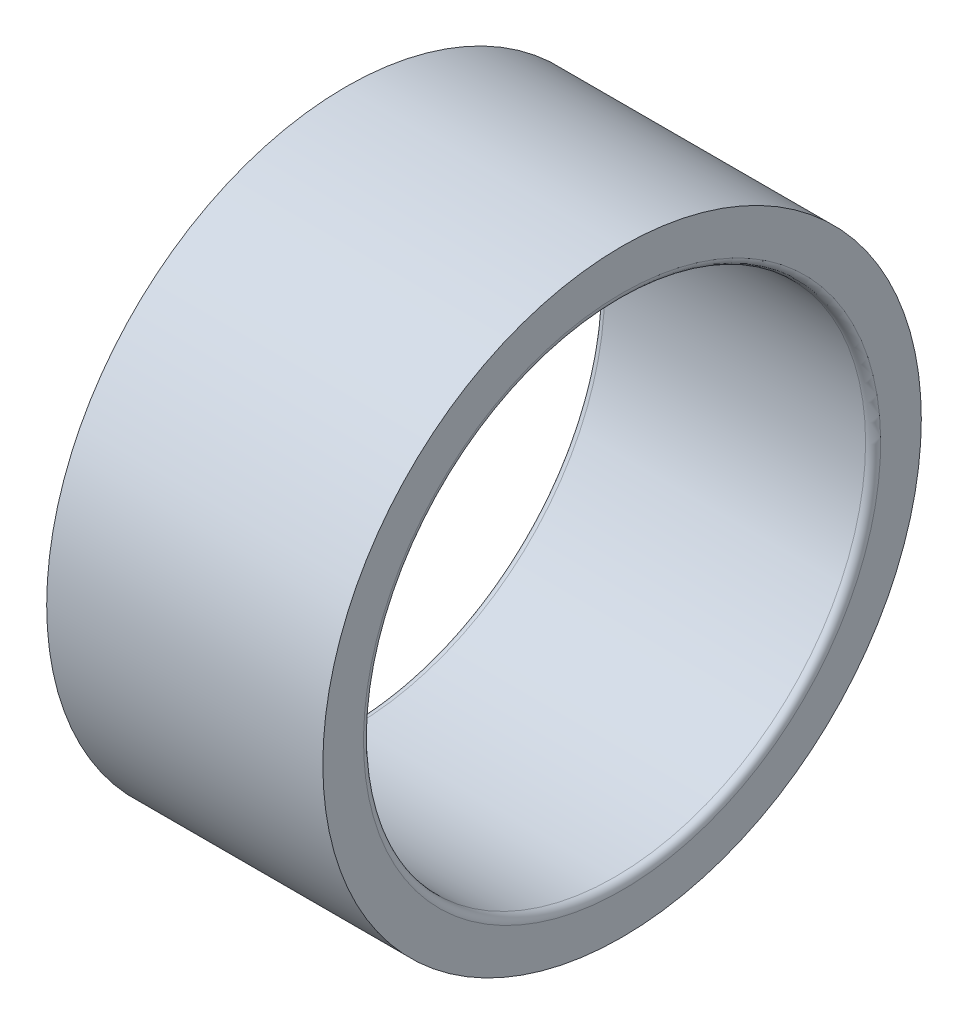
ISO-10303-21;
HEADER;
FILE_DESCRIPTION(('STEP AP214'),'2;1');
FILE_NAME('part.step','',(''),(''),'','','');
FILE_SCHEMA(('AUTOMOTIVE_DESIGN { 1 0 10303 214 1 1 1 1 }'));
ENDSEC;
DATA;
#1=APPLICATION_CONTEXT('core data for automotive mechanical design processes');
#2=APPLICATION_PROTOCOL_DEFINITION('international standard','automotive_design',2000,#1);
#3=PRODUCT_CONTEXT('',#1,'mechanical');
#4=PRODUCT('Part','Part','',(#3));
#5=PRODUCT_RELATED_PRODUCT_CATEGORY('part','',(#4));
#6=PRODUCT_DEFINITION_FORMATION('','',#4);
#7=PRODUCT_DEFINITION_CONTEXT('part definition',#1,'design');
#8=PRODUCT_DEFINITION('design','',#6,#7);
#9=PRODUCT_DEFINITION_SHAPE('','',#8);
#10=(LENGTH_UNIT() NAMED_UNIT(*) SI_UNIT(.MILLI.,.METRE.));
#11=(NAMED_UNIT(*) PLANE_ANGLE_UNIT() SI_UNIT($,.RADIAN.));
#12=(NAMED_UNIT(*) SI_UNIT($,.STERADIAN.) SOLID_ANGLE_UNIT());
#13=UNCERTAINTY_MEASURE_WITH_UNIT(LENGTH_MEASURE(1.E-05),#10,'distance_accuracy_value','');
#14=(GEOMETRIC_REPRESENTATION_CONTEXT(3) GLOBAL_UNCERTAINTY_ASSIGNED_CONTEXT((#13)) GLOBAL_UNIT_ASSIGNED_CONTEXT((#10,
#11,#12)) REPRESENTATION_CONTEXT('',''));
#15=CARTESIAN_POINT('',(0.,0.,0.));
#16=DIRECTION('',(0.,0.,1.));
#17=DIRECTION('',(1.,0.,0.));
#18=AXIS2_PLACEMENT_3D('',#15,#16,#17);
#19=CARTESIAN_POINT('',(26.,22.22,0.));
#20=DIRECTION('',(1.,0.,0.));
#21=DIRECTION('',(0.,1.,0.));
#22=AXIS2_PLACEMENT_3D('',#19,#20,#21);
#23=PLANE('',#22);
#24=CARTESIAN_POINT('',(26.,0.,0.));
#25=DIRECTION('',(1.,0.,0.));
#26=DIRECTION('',(0.,1.,0.));
#27=AXIS2_PLACEMENT_3D('',#24,#25,#26);
#28=CIRCLE('',#27,23.84);
#29=CARTESIAN_POINT('',(26.,23.84,0.));
#30=VERTEX_POINT('',#29);
#31=EDGE_CURVE('E11',#30,#30,#28,.T.);
#32=ORIENTED_EDGE('',*,*,#31,.T.);
#33=EDGE_LOOP('',(#32));
#34=FACE_BOUND('',#33,.T.);
#35=CARTESIAN_POINT('',(26.,0.,0.));
#36=DIRECTION('',(1.,0.,0.));
#37=DIRECTION('',(0.,1.,0.));
#38=AXIS2_PLACEMENT_3D('',#35,#36,#37);
#39=CIRCLE('',#38,20.6);
#40=CARTESIAN_POINT('',(26.,20.6,0.));
#41=VERTEX_POINT('',#40);
#42=EDGE_CURVE('E96',#41,#41,#39,.T.);
#43=ORIENTED_EDGE('',*,*,#42,.F.);
#44=EDGE_LOOP('',(#43));
#45=FACE_BOUND('',#44,.T.);
#46=ADVANCED_FACE('F17',(#34,#45),#23,.T.);
#47=CARTESIAN_POINT('',(15.,0.,0.));
#48=DIRECTION('',(-1.,0.,0.));
#49=DIRECTION('',(0.,1.,0.));
#50=AXIS2_PLACEMENT_3D('',#47,#48,#49);
#51=CYLINDRICAL_SURFACE('',#50,23.84);
#52=CARTESIAN_POINT('',(4.,0.,0.));
#53=DIRECTION('',(1.,0.,0.));
#54=DIRECTION('',(0.,1.,0.));
#55=AXIS2_PLACEMENT_3D('',#52,#53,#54);
#56=CIRCLE('',#55,23.84);
#57=CARTESIAN_POINT('',(4.,23.84,0.));
#58=VERTEX_POINT('',#57);
#59=EDGE_CURVE('E29',#58,#58,#56,.T.);
#60=ORIENTED_EDGE('',*,*,#59,.T.);
#61=EDGE_LOOP('',(#60));
#62=FACE_BOUND('',#61,.T.);
#63=ORIENTED_EDGE('',*,*,#31,.F.);
#64=EDGE_LOOP('',(#63));
#65=FACE_BOUND('',#64,.T.);
#66=ADVANCED_FACE('F19',(#62,#65),#51,.T.);
#67=CARTESIAN_POINT('',(4.,22.22,0.));
#68=DIRECTION('',(-1.,0.,0.));
#69=DIRECTION('',(0.,-1.,0.));
#70=AXIS2_PLACEMENT_3D('',#67,#68,#69);
#71=PLANE('',#70);
#72=CARTESIAN_POINT('',(4.,0.,0.));
#73=DIRECTION('',(1.,0.,0.));
#74=DIRECTION('',(0.,1.,0.));
#75=AXIS2_PLACEMENT_3D('',#72,#73,#74);
#76=CIRCLE('',#75,20.6);
#77=CARTESIAN_POINT('',(4.,20.6,0.));
#78=VERTEX_POINT('',#77);
#79=EDGE_CURVE('E57',#78,#78,#76,.T.);
#80=ORIENTED_EDGE('',*,*,#79,.T.);
#81=EDGE_LOOP('',(#80));
#82=FACE_BOUND('',#81,.T.);
#83=ORIENTED_EDGE('',*,*,#59,.F.);
#84=EDGE_LOOP('',(#83));
#85=FACE_BOUND('',#84,.T.);
#86=ADVANCED_FACE('F76',(#82,#85),#71,.T.);
#87=CARTESIAN_POINT('',(4.6,0.,0.));
#88=DIRECTION('',(1.,0.,0.));
#89=DIRECTION('',(0.,0.,-1.));
#90=AXIS2_PLACEMENT_3D('',#87,#88,#89);
#91=TOROIDAL_SURFACE('',#90,20.6,0.6);
#92=CARTESIAN_POINT('',(4.6,0.,0.));
#93=DIRECTION('',(1.,0.,0.));
#94=DIRECTION('',(0.,1.,0.));
#95=AXIS2_PLACEMENT_3D('',#92,#93,#94);
#96=CIRCLE('',#95,20.);
#97=CARTESIAN_POINT('',(4.6,20.,0.));
#98=VERTEX_POINT('',#97);
#99=EDGE_CURVE('E100',#98,#98,#96,.T.);
#100=ORIENTED_EDGE('',*,*,#99,.T.);
#101=EDGE_LOOP('',(#100));
#102=FACE_BOUND('',#101,.T.);
#103=ORIENTED_EDGE('',*,*,#79,.F.);
#104=EDGE_LOOP('',(#103));
#105=FACE_BOUND('',#104,.T.);
#106=ADVANCED_FACE('F72',(#102,#105),#91,.T.);
#107=CARTESIAN_POINT('',(15.,0.,0.));
#108=DIRECTION('',(-1.,0.,0.));
#109=DIRECTION('',(0.,1.,0.));
#110=AXIS2_PLACEMENT_3D('',#107,#108,#109);
#111=CYLINDRICAL_SURFACE('',#110,20.);
#112=CARTESIAN_POINT('',(25.4,0.,0.));
#113=DIRECTION('',(1.,0.,0.));
#114=DIRECTION('',(0.,1.,0.));
#115=AXIS2_PLACEMENT_3D('',#112,#113,#114);
#116=CIRCLE('',#115,20.);
#117=CARTESIAN_POINT('',(25.4,20.,0.));
#118=VERTEX_POINT('',#117);
#119=EDGE_CURVE('E101',#118,#118,#116,.T.);
#120=ORIENTED_EDGE('',*,*,#119,.T.);
#121=EDGE_LOOP('',(#120));
#122=FACE_BOUND('',#121,.T.);
#123=ORIENTED_EDGE('',*,*,#99,.F.);
#124=EDGE_LOOP('',(#123));
#125=FACE_BOUND('',#124,.T.);
#126=CARTESIAN_POINT('',(15.,19.9436706751791,1.5));
#127=CARTESIAN_POINT('',(15.023980802461,19.9436710684542,1.49999331675062));
#128=CARTESIAN_POINT('',(15.0479604681232,19.9437164250224,1.49939168004259));
#129=CARTESIAN_POINT('',(15.0959637294917,19.9438950890934,1.4970141183959));
#130=CARTESIAN_POINT('',(15.1199870773639,19.9440287703363,1.49523320334707));
#131=CARTESIAN_POINT('',(15.1680774613603,19.9443832363342,1.49049745799294));
#132=CARTESIAN_POINT('',(15.1921437325988,19.9446045922579,1.48753492899746));
#133=CARTESIAN_POINT('',(15.2403205020601,19.9451325285161,1.48043953807659));
#134=CARTESIAN_POINT('',(15.26442948643,19.9454398500646,1.47629649140751));
#135=CARTESIAN_POINT('',(15.3131315536388,19.946143853933,1.46675458037655));
#136=CARTESIAN_POINT('',(15.3377180916965,19.9465428931121,1.4613224429462));
#137=CARTESIAN_POINT('',(15.3863769413026,19.9474198662536,1.44930212194746));
#138=CARTESIAN_POINT('',(15.4104518728253,19.9478970763389,1.44272451333143));
#139=CARTESIAN_POINT('',(15.4580874727516,19.9489267481172,1.42841615242702));
#140=CARTESIAN_POINT('',(15.4816504448731,19.949478709228,1.4206930409385));
#141=CARTESIAN_POINT('',(15.5282627098288,19.9506536579477,1.40409670044076));
#142=CARTESIAN_POINT('',(15.5513136476873,19.9512763601425,1.39522807460773));
#143=CARTESIAN_POINT('',(15.5969120138774,19.9525883921862,1.37633787770728));
#144=CARTESIAN_POINT('',(15.6194598749038,19.9532776618287,1.36631734693983));
#145=CARTESIAN_POINT('',(15.6641214412139,19.9547189650343,1.34510390995097));
#146=CARTESIAN_POINT('',(15.6862326880103,19.9554712713405,1.33390584936858));
#147=CARTESIAN_POINT('',(15.7300228142682,19.9570325708787,1.31034017768309));
#148=CARTESIAN_POINT('',(15.7516975223367,19.9578419278595,1.29796484493805));
#149=CARTESIAN_POINT('',(15.7946160778946,19.9595107068897,1.27204656477276));
#150=CARTESIAN_POINT('',(15.8158538841722,19.9603705311789,1.25849365086004));
#151=CARTESIAN_POINT('',(15.8570532208134,19.9620975165634,1.23079241696214));
#152=CARTESIAN_POINT('',(15.8770338927284,19.9629637528728,1.21667249358004));
#153=CARTESIAN_POINT('',(15.916114361581,19.9647127466993,1.18762560886494));
#154=CARTESIAN_POINT('',(15.9352205787076,19.9655952784407,1.17270728258423));
#155=CARTESIAN_POINT('',(15.9725526831814,19.9673713859091,1.14206557793876));
#156=CARTESIAN_POINT('',(15.9907837900851,19.9682648413339,1.1263485551099));
#157=CARTESIAN_POINT('',(16.0263673651875,19.9700570531928,1.09411181495279));
#158=CARTESIAN_POINT('',(16.0437235335571,19.9709557654911,1.07759618164708));
#159=CARTESIAN_POINT('',(16.0775851950106,19.9727540111879,1.04373577650502));
#160=CARTESIAN_POINT('',(16.0940912214562,19.9736535437022,1.02639153801705));
#161=CARTESIAN_POINT('',(16.1263153699827,19.9754495871582,0.990824129159826));
#162=CARTESIAN_POINT('',(16.1420290328995,19.9763460591459,0.972596918901357));
#163=CARTESIAN_POINT('',(16.1726708287599,19.9781288145781,0.935265126406107));
#164=CARTESIAN_POINT('',(16.1875922254421,19.9790149720863,0.916155012328557));
#165=CARTESIAN_POINT('',(16.2166522970037,19.9807695918459,0.87705931915174));
#166=CARTESIAN_POINT('',(16.2307819620536,19.9816377986363,0.857067039773861));
#167=CARTESIAN_POINT('',(16.2584846987131,19.9833629687558,0.815868705662425));
#168=CARTESIAN_POINT('',(16.2720305653312,19.9842189124512,0.79464430460597));
#169=CARTESIAN_POINT('',(16.2979398582807,19.985878468615,0.751743547153647));
#170=CARTESIAN_POINT('',(16.3103128286278,19.9866824827042,0.730072976882195));
#171=CARTESIAN_POINT('',(16.3338789592962,19.9882338667972,0.68628251232157));
#172=CARTESIAN_POINT('',(16.345079396795,19.9889815769602,0.664166548834345));
#173=CARTESIAN_POINT('',(16.3663030676505,19.9904160291942,0.619487243255145));
#174=CARTESIAN_POINT('',(16.376330999111,19.9911030116885,0.596926141939594));
#175=CARTESIAN_POINT('',(16.3952225063084,19.9924124519929,0.551329563755814));
#176=CARTESIAN_POINT('',(16.4040865129006,19.9930349336614,0.528294266096447));
#177=CARTESIAN_POINT('',(16.4206770431784,19.9942118578399,0.481702786246169));
#178=CARTESIAN_POINT('',(16.4283984318771,19.9947659914392,0.458144769031443));
#179=CARTESIAN_POINT('',(16.4427072772283,19.9958009036741,0.410509036600132));
#180=CARTESIAN_POINT('',(16.4492865789474,19.9962811521821,0.386428862861273));
#181=CARTESIAN_POINT('',(16.4613138903367,19.9971628805585,0.337749602714912));
#182=CARTESIAN_POINT('',(16.4667508364302,19.9975635881946,0.31314777462503));
#183=CARTESIAN_POINT('',(16.4763045119005,19.998266561026,0.264408416299162));
#184=CARTESIAN_POINT('',(16.4804541572247,19.9985712843513,0.240277365889277));
#185=CARTESIAN_POINT('',(16.4875577059204,19.9990920868663,0.192070753435031));
#186=CARTESIAN_POINT('',(16.4905225163182,19.9993089748864,0.167996814053359));
#187=CARTESIAN_POINT('',(16.4952583730207,19.9996549120953,0.119905944142487));
#188=CARTESIAN_POINT('',(16.4970378640763,19.9997845827264,0.0958898519845909));
#189=CARTESIAN_POINT('',(16.4994058572011,19.99995691634,0.0479156477815767));
#190=CARTESIAN_POINT('',(16.5000001175012,19.9999999999977,0.0239578230083356));
#191=CARTESIAN_POINT('',(16.4999998825283,20.0000000000023,-0.0239518156098222));
#192=CARTESIAN_POINT('',(16.499405685297,19.9999569379529,-0.0479036294556239));
#193=CARTESIAN_POINT('',(16.4970378376718,19.9997846763257,-0.0958698235527699));
#194=CARTESIAN_POINT('',(16.4952582312377,19.9996550417594,-0.11988390664371));
#195=CARTESIAN_POINT('',(16.4905222670967,19.9993091626476,-0.167974750064875));
#196=CARTESIAN_POINT('',(16.4875572743388,19.9990922824804,-0.192050652939226));
#197=CARTESIAN_POINT('',(16.4804540222514,19.9985714363363,-0.240265309905812));
#198=CARTESIAN_POINT('',(16.4763046819705,19.9982666475754,-0.264402415864912));
#199=CARTESIAN_POINT('',(16.4667542033392,19.9975637598077,-0.313135875820699));
#200=CARTESIAN_POINT('',(16.4613209866334,19.9971632660456,-0.337725917082664));
#201=CARTESIAN_POINT('',(16.4492986960465,19.9962819085336,-0.386389484167737));
#202=CARTESIAN_POINT('',(16.4427203047546,19.9958017893614,-0.410465656985472));
#203=CARTESIAN_POINT('',(16.4284112847855,19.9947669913326,-0.458101335590933));
#204=CARTESIAN_POINT('',(16.4206884168677,19.9942128169604,-0.481663181389407));
#205=CARTESIAN_POINT('',(16.4040935724591,19.9930355731538,-0.528270576860182));
#206=CARTESIAN_POINT('',(16.3952263344836,19.9924127892878,-0.551317819733703));
#207=CARTESIAN_POINT('',(16.3763365990064,19.9911033279332,-0.596915128782865));
#208=CARTESIAN_POINT('',(16.3663148289848,19.9904166907311,-0.619465497485864));
#209=CARTESIAN_POINT('',(16.3450993656328,19.9889827709195,-0.664130504468885));
#210=CARTESIAN_POINT('',(16.3339005940014,19.988235228928,-0.686242720836129));
#211=CARTESIAN_POINT('',(16.3103342867197,19.9866839433985,-0.730033096083931));
#212=CARTESIAN_POINT('',(16.2979591118482,19.9858798427802,-0.751707128202924));
#213=CARTESIAN_POINT('',(16.27204232145,19.9842197883292,-0.794622565570553));
#214=CARTESIAN_POINT('',(16.2584908271441,19.9833634178233,-0.815857982072819));
#215=CARTESIAN_POINT('',(16.2307893803817,19.9816381951107,-0.8570575712127));
#216=CARTESIAN_POINT('',(16.2166675853829,19.9807703984325,-0.877040729909963));
#217=CARTESIAN_POINT('',(16.1876179930195,19.9790163792966,-0.91612426818883));
#218=CARTESIAN_POINT('',(16.1726989100111,19.9781304031621,-0.935231127904905));
#219=CARTESIAN_POINT('',(16.1420569672864,19.9763477230401,-0.97256280229388));
#220=CARTESIAN_POINT('',(16.1263405429935,19.9754511393444,-0.990792902186295));
#221=CARTESIAN_POINT('',(16.0941065089928,19.9736545065416,-1.02637295637634));
#222=CARTESIAN_POINT('',(16.0775930626209,19.9727544941635,-1.04372668235683));
#223=CARTESIAN_POINT('',(16.043732629496,19.9709561833997,-1.07758831242582));
#224=CARTESIAN_POINT('',(16.0263859504182,19.9700578845068,-1.09409652414215));
#225=CARTESIAN_POINT('',(15.9908150205399,19.9682662598783,-1.12632337867839));
#226=CARTESIAN_POINT('',(15.9725868013937,19.967372981747,-1.14203764174179));
#227=CARTESIAN_POINT('',(15.9352545750735,19.9655969296437,-1.17267920249121));
#228=CARTESIAN_POINT('',(15.9161451017194,19.9647142816745,-1.18759984380156));
#229=CARTESIAN_POINT('',(15.8770524781964,19.9629646897993,-1.2166572081823));
#230=CARTESIAN_POINT('',(15.8570626877123,19.9620979789101,-1.23078500062745));
#231=CARTESIAN_POINT('',(15.8158646101096,19.9603709133943,-1.25848752023458));
#232=CARTESIAN_POINT('',(15.7946378210064,19.9595114523869,-1.27203480331547));
#233=CARTESIAN_POINT('',(15.7517339476416,19.9578431792846,-1.29794558984251));
#234=CARTESIAN_POINT('',(15.7300627020256,19.9570339781615,-1.31031872496316));
#235=CARTESIAN_POINT('',(15.6862724761074,19.9554727191939,-1.33388420591455));
#236=CARTESIAN_POINT('',(15.6641574712951,19.9547203146362,-1.34508391151557));
#237=CARTESIAN_POINT('',(15.6194816302206,19.9532784679337,-1.36630561642376));
#238=CARTESIAN_POINT('',(15.5969230710606,19.9525887733201,-1.37633238938887));
#239=CARTESIAN_POINT('',(15.5513308957782,19.9512767934768,-1.39522183648666));
#240=CARTESIAN_POINT('',(15.5282974462201,19.950654485075,-1.40408491100379));
#241=CARTESIAN_POINT('',(15.4817085250093,19.9494800685112,-1.42067394724172));
#242=CARTESIAN_POINT('',(15.4581511981749,19.9489282822774,-1.42839471803276));
#243=CARTESIAN_POINT('',(15.4105155361025,19.9478986454463,-1.44270282504004));
#244=CARTESIAN_POINT('',(15.3864347218858,19.9474213336088,-1.44928193749416));
#245=CARTESIAN_POINT('',(15.3377528506793,19.9465437643083,-1.46131057433586));
#246=CARTESIAN_POINT('',(15.3131490348486,19.9461442687565,-1.46674896591908));
#247=CARTESIAN_POINT('',(15.2644415135315,19.9454398666036,-1.47629625950975));
#248=CARTESIAN_POINT('',(15.2403446301726,19.9451325051213,-1.48043982152221));
#249=CARTESIAN_POINT('',(15.1921839155903,19.9446045331673,-1.48753575388195));
#250=CARTESIAN_POINT('',(15.1681215470376,19.9443832069533,-1.49049795776152));
#251=CARTESIAN_POINT('',(15.1200311878586,19.9440287438214,-1.49523345103187));
#252=CARTESIAN_POINT('',(15.0960039231964,19.9438950640807,-1.49701405927389));
#253=CARTESIAN_POINT('',(15.0479843625317,19.9437164220092,-1.49939211057682));
#254=CARTESIAN_POINT('',(15.0239922966881,19.9436711150923,-1.4999941491887));
#255=CARTESIAN_POINT('',(14.9760856522211,19.9436702366952,-1.5000058318024));
#256=CARTESIAN_POINT('',(14.9521710750954,19.9437143741504,-1.49941934343702));
#257=CARTESIAN_POINT('',(14.9042547555097,19.9438915043925,-1.49706147210059));
#258=CARTESIAN_POINT('',(14.8802533716105,19.9440250377304,-1.49528288074878));
#259=CARTESIAN_POINT('',(14.8321629626202,19.9443795960122,-1.49054627965521));
#260=CARTESIAN_POINT('',(14.8080749187494,19.9446013528736,-1.48757840185711));
#261=CARTESIAN_POINT('',(14.7598104725361,19.9451305133299,-1.48046668587424));
#262=CARTESIAN_POINT('',(14.7356358972889,19.9454388107329,-1.47631056652112));
#263=CARTESIAN_POINT('',(14.6868686864449,19.9461439471503,-1.46675332899753));
#264=CARTESIAN_POINT('',(14.6622819723675,19.9465429179814,-1.46132210909245));
#265=CARTESIAN_POINT('',(14.6136229952318,19.9474198416019,-1.44930245288015));
#266=CARTESIAN_POINT('',(14.5895481102407,19.9478970697536,-1.44272460173489));
#267=CARTESIAN_POINT('',(14.5419125441233,19.9489267546593,-1.42841606460445));
#268=CARTESIAN_POINT('',(14.5183495596561,19.9494787109774,-1.42069301745447));
#269=CARTESIAN_POINT('',(14.4717372856955,19.9506536562044,-1.4040967238444));
#270=CARTESIAN_POINT('',(14.4486863511168,19.9512763596754,-1.39522808087828));
#271=CARTESIAN_POINT('',(14.4030879873292,19.9525883926526,-1.37633787144711));
#272=CARTESIAN_POINT('',(14.380540125429,19.9532776619536,-1.36631734526319));
#273=CARTESIAN_POINT('',(14.3358785584787,19.9547189649078,-1.34510391164998));
#274=CARTESIAN_POINT('',(14.313767311921,19.955471271306,-1.33390584983296));
#275=CARTESIAN_POINT('',(14.2699771858381,19.9570325709122,-1.31034017723549));
#276=CARTESIAN_POINT('',(14.2483024777038,19.9578419278681,-1.29796484482403));
#277=CARTESIAN_POINT('',(14.2053839220917,19.9595107068801,-1.27204656490233));
#278=CARTESIAN_POINT('',(14.1841461158267,19.9603705311763,-1.2584936508954));
#279=CARTESIAN_POINT('',(14.1429467791835,19.9620975165662,-1.23079241692486));
#280=CARTESIAN_POINT('',(14.1229661072548,19.9629637528741,-1.2166724935608));
#281=CARTESIAN_POINT('',(14.0838856383869,19.9647127466998,-1.18762560885526));
#282=CARTESIAN_POINT('',(14.0647794212583,19.9655952784417,-1.17270728256665));
#283=CARTESIAN_POINT('',(14.0274473167852,19.9673713859104,-1.14206557791677));
#284=CARTESIAN_POINT('',(14.009216209884,19.968264841335,-1.12634855509163));
#285=CARTESIAN_POINT('',(13.9736326347939,19.9700570531933,-1.09411181494258));
#286=CARTESIAN_POINT('',(13.9562764664339,19.9709557654914,-1.07759618164149));
#287=CARTESIAN_POINT('',(13.9224148049774,19.9727540111887,-1.04373577648948));
#288=CARTESIAN_POINT('',(13.9059087785203,19.9736535437038,-1.0263915379859));
#289=CARTESIAN_POINT('',(13.8736846299786,19.9754495871608,-0.990824129107803));
#290=CARTESIAN_POINT('',(13.8579709670575,19.9763460591487,-0.972596918844506));
#291=CARTESIAN_POINT('',(13.8273291711969,19.9781288145807,-0.935265126349414));
#292=CARTESIAN_POINT('',(13.8124077745183,19.9790149720886,-0.916155012277252));
#293=CARTESIAN_POINT('',(13.7833477029728,19.9807695918472,-0.877059319120742));
#294=CARTESIAN_POINT('',(13.7692180379349,19.9816377986369,-0.857067039758144));
#295=CARTESIAN_POINT('',(13.7415153012817,19.9833629687562,-0.815868705653084));
#296=CARTESIAN_POINT('',(13.7279694346589,19.984218912452,-0.794644304586928));
#297=CARTESIAN_POINT('',(13.7020601417032,19.9858784686162,-0.751743547121721));
#298=CARTESIAN_POINT('',(13.6896871713543,19.9866824827055,-0.73007297684726));
#299=CARTESIAN_POINT('',(13.6661210406857,19.9882338667984,-0.686282512286716));
#300=CARTESIAN_POINT('',(13.6549206031884,19.9889815769612,-0.66416654880275));
#301=CARTESIAN_POINT('',(13.6336969323396,19.9904160291948,-0.619487243236081));
#302=CARTESIAN_POINT('',(13.6236690008842,19.9911030116888,-0.596926141929957));
#303=CARTESIAN_POINT('',(13.6047774936908,19.992412451993,-0.551329563751962));
#304=CARTESIAN_POINT('',(13.5959134870983,19.9930349336616,-0.52829426608867));
#305=CARTESIAN_POINT('',(13.57932295682,19.9942118578402,-0.481702786233218));
#306=CARTESIAN_POINT('',(13.5716015681209,19.9947659914395,-0.458144769017288));
#307=CARTESIAN_POINT('',(13.5572927227696,19.9958009036744,-0.410509036586013));
#308=CARTESIAN_POINT('',(13.5507134210507,19.9962811521823,-0.386428862848433));
#309=CARTESIAN_POINT('',(13.5386861096623,19.9971628805586,-0.337749602707163));
#310=CARTESIAN_POINT('',(13.5332491635693,19.9975635881946,-0.313147774621125));
#311=CARTESIAN_POINT('',(13.5236954880994,19.998266561026,-0.264408416299876));
#312=CARTESIAN_POINT('',(13.5195458427752,19.9985712843513,-0.24027736589074));
#313=CARTESIAN_POINT('',(13.5124422940796,19.9990920868662,-0.192070753437506));
#314=CARTESIAN_POINT('',(13.5094774836818,19.9993089748864,-0.167996814056093));
#315=CARTESIAN_POINT('',(13.5047416269793,19.9996549120953,-0.119905944145262));
#316=CARTESIAN_POINT('',(13.5029621359237,19.9997845827263,-0.0958898519871454));
#317=CARTESIAN_POINT('',(13.5005941427989,19.99995691634,-0.047915647783189));
#318=CARTESIAN_POINT('',(13.4999998824987,19.9999999999977,-0.0239578230092253));
#319=CARTESIAN_POINT('',(13.5000001174718,20.0000000000023,0.0239518156068419));
#320=CARTESIAN_POINT('',(13.5005943147031,19.9999569379529,0.0479036294498303));
#321=CARTESIAN_POINT('',(13.5029621623282,19.9997846763258,0.0958698235432351));
#322=CARTESIAN_POINT('',(13.5047417687624,19.9996550417595,0.119883906633243));
#323=CARTESIAN_POINT('',(13.5094777329034,19.9993091626477,0.16797475005443));
#324=CARTESIAN_POINT('',(13.5124427256614,19.9990922824805,0.192050652929727));
#325=CARTESIAN_POINT('',(13.5195459777487,19.9985714363364,0.24026530990015));
#326=CARTESIAN_POINT('',(13.5236953180294,19.9982666475754,0.264402415862127));
#327=CARTESIAN_POINT('',(13.5332457966591,19.9975637598078,0.313135875814729));
#328=CARTESIAN_POINT('',(13.5386790133631,19.9971632660458,0.337725917070713));
#329=CARTESIAN_POINT('',(13.5507013039475,19.996281908534,0.386389484147835));
#330=CARTESIAN_POINT('',(13.5572796952389,19.9958017893618,0.410465656963553));
#331=CARTESIAN_POINT('',(13.5715887152082,19.9947669913331,0.458101335568973));
#332=CARTESIAN_POINT('',(13.5793115831268,19.9942128169608,0.481663181369365));
#333=CARTESIAN_POINT('',(13.5959064275374,19.9930355731541,0.528270576848249));
#334=CARTESIAN_POINT('',(13.6047736655143,19.992412789288,0.551317819727888));
#335=CARTESIAN_POINT('',(13.6236634009872,19.9911033279336,0.596915128768188));
#336=CARTESIAN_POINT('',(13.6336851710019,19.990416690732,0.619465497456644));
#337=CARTESIAN_POINT('',(13.6549006343446,19.9889827709211,0.664130504420354));
#338=CARTESIAN_POINT('',(13.6660994059739,19.9882352289299,0.686242720782596));
#339=CARTESIAN_POINT('',(13.6896657132558,19.9866839434004,0.730033096030273));
#340=CARTESIAN_POINT('',(13.70204088813,19.9858798427821,0.751707128153892));
#341=CARTESIAN_POINT('',(13.7279576785367,19.9842197883303,0.794622565541242));
#342=CARTESIAN_POINT('',(13.7415091728489,19.9833634178239,0.815857982058346));
#343=CARTESIAN_POINT('',(13.7692106196086,19.9816381951112,0.857057571202303));
#344=CARTESIAN_POINT('',(13.7833324145971,19.9807703984333,0.877040729889591));
#345=CARTESIAN_POINT('',(13.8123820069469,19.9790163792982,0.916124268155083));
#346=CARTESIAN_POINT('',(13.8273010899523,19.9781304031638,0.935231127867505));
#347=CARTESIAN_POINT('',(13.8579430326772,19.9763477230419,0.972562802256402));
#348=CARTESIAN_POINT('',(13.8736594569736,19.9754511393461,0.990792902152102));
#349=CARTESIAN_POINT('',(13.9058934909873,19.9736545065426,1.02637295635597));
#350=CARTESIAN_POINT('',(13.9224069373691,19.9727544941641,1.04372668234668));
#351=CARTESIAN_POINT('',(13.9562673705004,19.9709561833999,1.07758831242235));
#352=CARTESIAN_POINT('',(13.973614049574,19.9700578845071,1.09409652413582));
#353=CARTESIAN_POINT('',(14.0091849794473,19.9682662598789,1.12632337866647));
#354=CARTESIAN_POINT('',(14.0274131985926,19.9673729817479,1.142037641727));
#355=CARTESIAN_POINT('',(14.064745424912,19.9655969296443,1.17267920248077));
#356=CARTESIAN_POINT('',(14.0838548982663,19.9647142816746,1.18759984379826));
#357=CARTESIAN_POINT('',(14.1229475217975,19.9629646898003,1.21665720816705));
#358=CARTESIAN_POINT('',(14.1429373122898,19.9620979789127,1.2307850005927));
#359=CARTESIAN_POINT('',(14.1841353898809,19.960370913392,1.25848752026549));
#360=CARTESIAN_POINT('',(14.2053621789637,19.9595114523781,1.27203480343503));
#361=CARTESIAN_POINT('',(14.24826605237,19.9578431792938,1.29794558971701));
#362=CARTESIAN_POINT('',(14.2699372980474,19.9570339781949,1.31031872450768));
#363=CARTESIAN_POINT('',(14.3137275237953,19.9554727191614,1.33388420635712));
#364=CARTESIAN_POINT('',(14.3358425283778,19.9547203145142,1.34508391317563));
#365=CARTESIAN_POINT('',(14.3805183700871,19.9532784680557,1.36630561476353));
#366=CARTESIAN_POINT('',(14.403076930107,19.9525887737738,1.37633238321503));
#367=CARTESIAN_POINT('',(14.4486691030549,19.9512767930232,1.39522184265856));
#368=CARTESIAN_POINT('',(14.47170254942,19.9506544833829,1.40408493402767));
#369=CARTESIAN_POINT('',(14.5182914793887,19.9494800702101,1.42067392412434));
#370=CARTESIAN_POINT('',(14.5418488182408,19.9489282886317,1.4283946315696));
#371=CARTESIAN_POINT('',(14.589484447394,19.9478986390472,1.44270291211336));
#372=CARTESIAN_POINT('',(14.6135652162787,19.9474213096478,1.44928226353309));
#373=CARTESIAN_POINT('',(14.662247211753,19.9465437884926,1.46131024525764));
#374=CARTESIAN_POINT('',(14.6868511991965,19.9461443594278,1.46674773214698));
#375=CARTESIAN_POINT('',(14.7356238772325,19.9454388294155,1.47631032200635));
#376=CARTESIAN_POINT('',(14.7597863692604,19.9451304985665,1.48046691282192));
#377=CARTESIAN_POINT('',(14.8080347126669,19.9446012815757,1.48757933183594));
#378=CARTESIAN_POINT('',(14.8321187881317,19.9443795270958,1.4905470919831));
#379=CARTESIAN_POINT('',(14.8802093519463,19.9440250452811,1.49528288733889));
#380=CARTESIAN_POINT('',(14.904214895822,19.9438916133546,1.49706041893059));
#381=CARTESIAN_POINT('',(14.9521468509525,19.9437142341863,1.49942081156859));
#382=CARTESIAN_POINT('',(14.9760729273158,19.9436697785111,1.50001046061241));
#383=CARTESIAN_POINT('',(15.,19.9436706751791,1.5));
#384=B_SPLINE_CURVE_WITH_KNOTS('',3,(#126,#127,#128,#129,#130,#131,#132,#133,#134,#135,#136,
#137,#138,#139,#140,#141,#142,#143,#144,#145,#146,#147,#148,#149,#150,#151,#152,#153,#154,#155,
#156,#157,#158,#159,#160,#161,#162,#163,#164,#165,#166,#167,#168,#169,#170,#171,#172,#173,#174,
#175,#176,#177,#178,#179,#180,#181,#182,#183,#184,#185,#186,#187,#188,#189,#190,#191,#192,#193,
#194,#195,#196,#197,#198,#199,#200,#201,#202,#203,#204,#205,#206,#207,#208,#209,#210,#211,#212,
#213,#214,#215,#216,#217,#218,#219,#220,#221,#222,#223,#224,#225,#226,#227,#228,#229,#230,#231,
#232,#233,#234,#235,#236,#237,#238,#239,#240,#241,#242,#243,#244,#245,#246,#247,#248,#249,#250,
#251,#252,#253,#254,#255,#256,#257,#258,#259,#260,#261,#262,#263,#264,#265,#266,#267,#268,#269,
#270,#271,#272,#273,#274,#275,#276,#277,#278,#279,#280,#281,#282,#283,#284,#285,#286,#287,#288,
#289,#290,#291,#292,#293,#294,#295,#296,#297,#298,#299,#300,#301,#302,#303,#304,#305,#306,#307,
#308,#309,#310,#311,#312,#313,#314,#315,#316,#317,#318,#319,#320,#321,#322,#323,#324,#325,#326,
#327,#328,#329,#330,#331,#332,#333,#334,#335,#336,#337,#338,#339,#340,#341,#342,#343,#344,#345,
#346,#347,#348,#349,#350,#351,#352,#353,#354,#355,#356,#357,#358,#359,#360,#361,#362,#363,#364,
#365,#366,#367,#368,#369,#370,#371,#372,#373,#374,#375,#376,#377,#378,#379,#380,#381,#382,#383),
.UNSPECIFIED.,.F.,.F.,(4,2,2,2,2,2,2,2,2,2,2,2,2,2,2,2,2,2,2,2,2,2,2,2,2,2,2,2,2,2,2,2,2,2,2,2,
2,2,2,2,2,2,2,2,2,2,2,2,2,2,2,2,2,2,2,2,2,2,2,2,2,2,2,2,2,2,2,2,2,2,2,2,2,2,2,2,2,2,2,2,2,2,2,2,
2,2,2,2,2,2,2,2,2,2,2,2,2,2,2,2,2,2,2,2,2,2,2,2,2,2,2,2,2,2,2,2,2,2,2,2,2,2,2,2,2,2,2,2,4),(0.,
0.0719336139223096,0.14417357647743,0.21689210787667,0.290258058201242,0.365776120661016,
0.440630765680538,0.5150068696404,0.589092891473499,0.663112523282445,0.737470827731722,
0.812355776000122,0.887951410762374,0.961369474886511,1.03411104747704,1.10634420592636,
1.17824059336319,1.25009131087157,1.3223093331913,1.39506622354231,1.46852976986717,
1.54407975198251,1.61894984315346,1.6933236256457,1.76738837237205,1.84142562445845,
1.91578610924336,1.9906574742259,2.06622356110266,2.139657975061,2.21239989023345,
2.28461785220844,2.35648409310079,2.42833231360955,2.50054428331832,2.57329216222135,
2.64674434215683,2.72227345912599,2.7971324719502,2.87150530766454,2.94557951494994,
3.01960730015237,3.09396872962728,3.16885117506028,3.24443813361885,3.31786567351788,
3.39061053379989,3.46284058663307,3.53472731089558,3.60658769168472,3.67880881964257,
3.75156242227011,3.8250164925834,3.9005751487363,3.97544774194931,4.04981840019235,
4.12387499548631,4.19790604357157,4.27226380568245,4.34713676345579,4.42270954389753,
4.4960399663108,4.56874657137227,4.64099851734367,4.71296816847644,4.78470399640023,
4.85687755582444,4.92966280085523,5.00322934657393,5.07874740901266,5.15360205402516,
5.22797815799208,5.30206417984631,5.37608381163805,5.45044211608158,5.52532706435572,
5.60092269913519,5.67434076329117,5.74708233589225,5.8193154943311,5.89121188173675,
5.96306259930313,6.03528062164226,6.10803751197383,6.18150105824039,6.2570510403877,
6.33192113156936,6.4062949140509,6.48035966074521,6.55439691284299,6.62875739763169,
6.70362876261041,6.77919484947556,6.85262926343166,6.92537117860333,6.99758914057898,
7.0694553814735,7.14130360197381,7.21351557167981,7.28626345058571,7.35971563052963,
7.43524474748007,7.51010376029804,7.58447659601862,7.65855080332272,7.73257858847687,
7.80694001793569,7.88182246338473,7.95740942199113,8.03083696184785,8.10358182211567,
8.17581187496311,8.24769859926841,8.31955898004202,8.39178010799469,8.4645337106274,
8.53798778095613,8.61354643709823,8.68841903030763,8.76278968855431,8.83684628385922,
8.91087733195598,8.98523509407067,9.06010805184019,9.13568083227058,9.20921185619122,
9.28198517648164,9.35417071833579,9.42594258190706),.UNSPECIFIED.);
#385=CARTESIAN_POINT('',(15.,19.9436706751791,1.5));
#386=VERTEX_POINT('',#385);
#387=EDGE_CURVE('E51',#386,#386,#384,.T.);
#388=ORIENTED_EDGE('',*,*,#387,.T.);
#389=EDGE_LOOP('',(#388));
#390=FACE_BOUND('',#389,.T.);
#391=ADVANCED_FACE('F53',(#122,#125,#390),#111,.F.);
#392=CARTESIAN_POINT('',(25.4,0.,0.));
#393=DIRECTION('',(1.,0.,0.));
#394=DIRECTION('',(0.,0.,-1.));
#395=AXIS2_PLACEMENT_3D('',#392,#393,#394);
#396=TOROIDAL_SURFACE('',#395,20.6,0.6);
#397=ORIENTED_EDGE('',*,*,#42,.T.);
#398=EDGE_LOOP('',(#397));
#399=FACE_BOUND('',#398,.T.);
#400=ORIENTED_EDGE('',*,*,#119,.F.);
#401=EDGE_LOOP('',(#400));
#402=FACE_BOUND('',#401,.T.);
#403=ADVANCED_FACE('F71',(#399,#402),#396,.T.);
#404=CARTESIAN_POINT('',(15.,22.625,0.));
#405=DIRECTION('',(0.,1.,0.));
#406=DIRECTION('',(1.,0.,0.));
#407=AXIS2_PLACEMENT_3D('',#404,#405,#406);
#408=PLANE('',#407);
#409=CARTESIAN_POINT('',(15.,22.625,0.));
#410=DIRECTION('',(0.,1.,0.));
#411=DIRECTION('',(1.,0.,0.));
#412=AXIS2_PLACEMENT_3D('',#409,#410,#411);
#413=CIRCLE('',#412,1.5);
#414=CARTESIAN_POINT('',(16.5,22.625,0.));
#415=VERTEX_POINT('',#414);
#416=EDGE_CURVE('E45',#415,#415,#413,.T.);
#417=ORIENTED_EDGE('',*,*,#416,.F.);
#418=EDGE_LOOP('',(#417));
#419=FACE_BOUND('',#418,.T.);
#420=ADVANCED_FACE('F81',(#419),#408,.F.);
#421=CARTESIAN_POINT('',(15.,20.,0.));
#422=DIRECTION('',(0.,-1.,0.));
#423=DIRECTION('',(1.,0.,0.));
#424=AXIS2_PLACEMENT_3D('',#421,#422,#423);
#425=CYLINDRICAL_SURFACE('',#424,1.5);
#426=ORIENTED_EDGE('',*,*,#416,.T.);
#427=EDGE_LOOP('',(#426));
#428=FACE_BOUND('',#427,.T.);
#429=ORIENTED_EDGE('',*,*,#387,.F.);
#430=EDGE_LOOP('',(#429));
#431=FACE_BOUND('',#430,.T.);
#432=ADVANCED_FACE('F83',(#428,#431),#425,.F.);
#433=CLOSED_SHELL('',(#46,#66,#86,#106,#391,#403,#420,#432));
#434=MANIFOLD_SOLID_BREP('B1',#433);
#435=ADVANCED_BREP_SHAPE_REPRESENTATION('',(#18,#434),#14);
#436=SHAPE_DEFINITION_REPRESENTATION(#9,#435);
ENDSEC;
END-ISO-10303-21;
